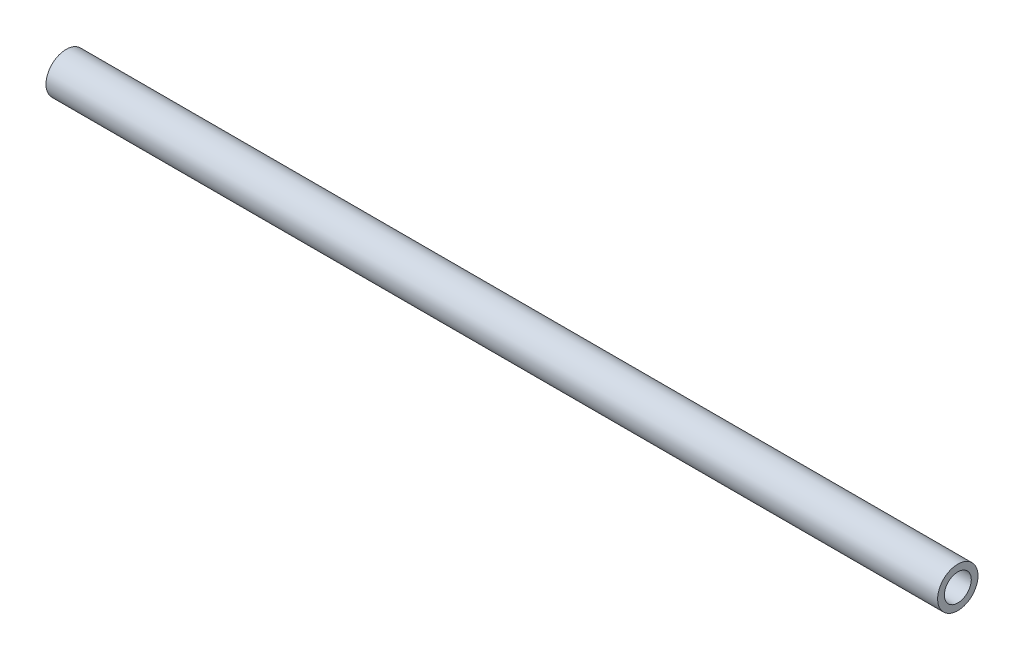
ISO-10303-21;
HEADER;
FILE_DESCRIPTION(('STEP AP214'),'2;1');
FILE_NAME('part.step','',(''),(''),'','','');
FILE_SCHEMA(('AUTOMOTIVE_DESIGN { 1 0 10303 214 1 1 1 1 }'));
ENDSEC;
DATA;
#1=APPLICATION_CONTEXT('core data for automotive mechanical design processes');
#2=APPLICATION_PROTOCOL_DEFINITION('international standard','automotive_design',2000,#1);
#3=PRODUCT_CONTEXT('',#1,'mechanical');
#4=PRODUCT('Part','Part','',(#3));
#5=PRODUCT_RELATED_PRODUCT_CATEGORY('part','',(#4));
#6=PRODUCT_DEFINITION_FORMATION('','',#4);
#7=PRODUCT_DEFINITION_CONTEXT('part definition',#1,'design');
#8=PRODUCT_DEFINITION('design','',#6,#7);
#9=PRODUCT_DEFINITION_SHAPE('','',#8);
#10=(LENGTH_UNIT() NAMED_UNIT(*) SI_UNIT(.MILLI.,.METRE.));
#11=(NAMED_UNIT(*) PLANE_ANGLE_UNIT() SI_UNIT($,.RADIAN.));
#12=(NAMED_UNIT(*) SI_UNIT($,.STERADIAN.) SOLID_ANGLE_UNIT());
#13=UNCERTAINTY_MEASURE_WITH_UNIT(LENGTH_MEASURE(1.E-05),#10,'distance_accuracy_value','');
#14=(GEOMETRIC_REPRESENTATION_CONTEXT(3) GLOBAL_UNCERTAINTY_ASSIGNED_CONTEXT((#13)) GLOBAL_UNIT_ASSIGNED_CONTEXT((#10,
#11,#12)) REPRESENTATION_CONTEXT('',''));
#15=CARTESIAN_POINT('',(0.,0.,0.));
#16=DIRECTION('',(0.,0.,1.));
#17=DIRECTION('',(1.,0.,0.));
#18=AXIS2_PLACEMENT_3D('',#15,#16,#17);
#19=CARTESIAN_POINT('',(0.,0.,0.));
#20=DIRECTION('',(-1.,0.,0.));
#21=DIRECTION('',(0.,0.,1.));
#22=AXIS2_PLACEMENT_3D('',#19,#20,#21);
#23=CYLINDRICAL_SURFACE('',#22,80.);
#24=CARTESIAN_POINT('',(900.,0.,0.));
#25=DIRECTION('',(-1.,0.,0.));
#26=DIRECTION('',(0.,0.,1.));
#27=AXIS2_PLACEMENT_3D('',#24,#25,#26);
#28=CIRCLE('',#27,80.);
#29=CARTESIAN_POINT('',(900.,80.,-5.74366884774658E-07));
#30=VERTEX_POINT('',#29);
#31=CARTESIAN_POINT('',(900.,80.,0.));
#32=VERTEX_POINT('',#31);
#33=EDGE_CURVE('E11',#30,#32,#28,.T.);
#34=ORIENTED_EDGE('',*,*,#33,.T.);
#35=DIRECTION('',(1.,0.,0.));
#36=VECTOR('',#35,1.);
#37=CARTESIAN_POINT('',(6200.,80.,0.));
#38=LINE('',#37,#36);
#39=CARTESIAN_POINT('',(6200.,80.,0.));
#40=VERTEX_POINT('',#39);
#41=EDGE_CURVE('E100',#32,#40,#38,.T.);
#42=ORIENTED_EDGE('',*,*,#41,.T.);
#43=CARTESIAN_POINT('',(6200.,0.,0.));
#44=DIRECTION('',(-1.,0.,0.));
#45=DIRECTION('',(0.,0.,1.));
#46=AXIS2_PLACEMENT_3D('',#43,#44,#45);
#47=CIRCLE('',#46,80.);
#48=CARTESIAN_POINT('',(6200.,80.,-5.74366884774658E-07));
#49=VERTEX_POINT('',#48);
#50=EDGE_CURVE('E80',#49,#40,#47,.T.);
#51=ORIENTED_EDGE('',*,*,#50,.F.);
#52=DIRECTION('',(1.,0.,0.));
#53=VECTOR('',#52,1.);
#54=CARTESIAN_POINT('',(6200.,80.,-5.74366884774658E-07));
#55=LINE('',#54,#53);
#56=EDGE_CURVE('E103',#30,#49,#55,.T.);
#57=ORIENTED_EDGE('',*,*,#56,.F.);
#58=EDGE_LOOP('',(#34,#42,#51,#57));
#59=FACE_BOUND('',#58,.T.);
#60=ADVANCED_FACE('F39',(#59),#23,.F.);
#61=CARTESIAN_POINT('',(900.,80.,-5.74366884774658E-07));
#62=DIRECTION('',(1.,0.,0.));
#63=DIRECTION('',(0.,0.,-1.));
#64=AXIS2_PLACEMENT_3D('',#61,#62,#63);
#65=PLANE('',#64);
#66=CARTESIAN_POINT('',(900.,0.,0.));
#67=DIRECTION('',(-1.,0.,0.));
#68=DIRECTION('',(0.,0.,1.));
#69=AXIS2_PLACEMENT_3D('',#66,#67,#68);
#70=CIRCLE('',#69,120.);
#71=CARTESIAN_POINT('',(900.,120.,-8.61550327161987E-07));
#72=VERTEX_POINT('',#71);
#73=CARTESIAN_POINT('',(900.,120.,0.));
#74=VERTEX_POINT('',#73);
#75=EDGE_CURVE('E50',#72,#74,#70,.T.);
#76=ORIENTED_EDGE('',*,*,#75,.T.);
#77=DIRECTION('',(0.,-1.,0.));
#78=VECTOR('',#77,1.);
#79=CARTESIAN_POINT('',(900.,80.,0.));
#80=LINE('',#79,#78);
#81=EDGE_CURVE('E104',#74,#32,#80,.T.);
#82=ORIENTED_EDGE('',*,*,#81,.T.);
#83=ORIENTED_EDGE('',*,*,#33,.F.);
#84=DIRECTION('',(0.,-1.,7.17958605968322E-09));
#85=VECTOR('',#84,1.);
#86=CARTESIAN_POINT('',(900.,80.,-5.74366884774658E-07));
#87=LINE('',#86,#85);
#88=EDGE_CURVE('E91',#72,#30,#87,.T.);
#89=ORIENTED_EDGE('',*,*,#88,.F.);
#90=EDGE_LOOP('',(#76,#82,#83,#89));
#91=FACE_BOUND('',#90,.T.);
#92=ADVANCED_FACE('F41',(#91),#65,.F.);
#93=CARTESIAN_POINT('',(0.,0.,0.));
#94=DIRECTION('',(-1.,0.,0.));
#95=DIRECTION('',(0.,0.,1.));
#96=AXIS2_PLACEMENT_3D('',#93,#94,#95);
#97=CYLINDRICAL_SURFACE('',#96,120.);
#98=CARTESIAN_POINT('',(6200.,0.,0.));
#99=DIRECTION('',(-1.,0.,0.));
#100=DIRECTION('',(0.,0.,1.));
#101=AXIS2_PLACEMENT_3D('',#98,#99,#100);
#102=CIRCLE('',#101,120.);
#103=CARTESIAN_POINT('',(6200.,120.,-8.61550327161987E-07));
#104=VERTEX_POINT('',#103);
#105=CARTESIAN_POINT('',(6200.,120.,0.));
#106=VERTEX_POINT('',#105);
#107=EDGE_CURVE('E89',#104,#106,#102,.T.);
#108=ORIENTED_EDGE('',*,*,#107,.T.);
#109=DIRECTION('',(-1.,0.,0.));
#110=VECTOR('',#109,1.);
#111=CARTESIAN_POINT('',(900.,120.,0.));
#112=LINE('',#111,#110);
#113=EDGE_CURVE('E97',#106,#74,#112,.T.);
#114=ORIENTED_EDGE('',*,*,#113,.T.);
#115=ORIENTED_EDGE('',*,*,#75,.F.);
#116=DIRECTION('',(-1.,0.,0.));
#117=VECTOR('',#116,1.);
#118=CARTESIAN_POINT('',(900.,120.,-8.61550327161987E-07));
#119=LINE('',#118,#117);
#120=EDGE_CURVE('E109',#104,#72,#119,.T.);
#121=ORIENTED_EDGE('',*,*,#120,.F.);
#122=EDGE_LOOP('',(#108,#114,#115,#121));
#123=FACE_BOUND('',#122,.T.);
#124=ADVANCED_FACE('F112',(#123),#97,.T.);
#125=CARTESIAN_POINT('',(6200.,120.,-8.61550327161987E-07));
#126=DIRECTION('',(-1.,0.,0.));
#127=DIRECTION('',(0.,0.,1.));
#128=AXIS2_PLACEMENT_3D('',#125,#126,#127);
#129=PLANE('',#128);
#130=DIRECTION('',(0.,1.,-7.17958605968322E-09));
#131=VECTOR('',#130,1.);
#132=CARTESIAN_POINT('',(6200.,120.,-8.61550327161987E-07));
#133=LINE('',#132,#131);
#134=EDGE_CURVE('E82',#49,#104,#133,.T.);
#135=ORIENTED_EDGE('',*,*,#134,.F.);
#136=ORIENTED_EDGE('',*,*,#50,.T.);
#137=DIRECTION('',(0.,1.,0.));
#138=VECTOR('',#137,1.);
#139=CARTESIAN_POINT('',(6200.,120.,0.));
#140=LINE('',#139,#138);
#141=EDGE_CURVE('E85',#40,#106,#140,.T.);
#142=ORIENTED_EDGE('',*,*,#141,.T.);
#143=ORIENTED_EDGE('',*,*,#107,.F.);
#144=EDGE_LOOP('',(#135,#136,#142,#143));
#145=FACE_BOUND('',#144,.T.);
#146=ADVANCED_FACE('F83',(#145),#129,.F.);
#147=CARTESIAN_POINT('',(0.,0.,0.));
#148=DIRECTION('',(0.,-7.17958605968322E-09,-1.));
#149=DIRECTION('',(-1.,0.,0.));
#150=AXIS2_PLACEMENT_3D('',#147,#148,#149);
#151=PLANE('',#150);
#152=ORIENTED_EDGE('',*,*,#56,.T.);
#153=ORIENTED_EDGE('',*,*,#134,.T.);
#154=ORIENTED_EDGE('',*,*,#120,.T.);
#155=ORIENTED_EDGE('',*,*,#88,.T.);
#156=EDGE_LOOP('',(#152,#153,#154,#155));
#157=FACE_BOUND('',#156,.T.);
#158=ADVANCED_FACE('F111',(#157),#151,.F.);
#159=CARTESIAN_POINT('',(0.,0.,0.));
#160=DIRECTION('',(0.,0.,-1.));
#161=DIRECTION('',(-1.,0.,0.));
#162=AXIS2_PLACEMENT_3D('',#159,#160,#161);
#163=PLANE('',#162);
#164=ORIENTED_EDGE('',*,*,#41,.F.);
#165=ORIENTED_EDGE('',*,*,#81,.F.);
#166=ORIENTED_EDGE('',*,*,#113,.F.);
#167=ORIENTED_EDGE('',*,*,#141,.F.);
#168=EDGE_LOOP('',(#164,#165,#166,#167));
#169=FACE_BOUND('',#168,.T.);
#170=ADVANCED_FACE('F94',(#169),#163,.T.);
#171=CLOSED_SHELL('',(#60,#92,#124,#146,#158,#170));
#172=MANIFOLD_SOLID_BREP('B2',#171);
#173=ADVANCED_BREP_SHAPE_REPRESENTATION('',(#18,#172),#14);
#174=SHAPE_DEFINITION_REPRESENTATION(#9,#173);
ENDSEC;
END-ISO-10303-21;
